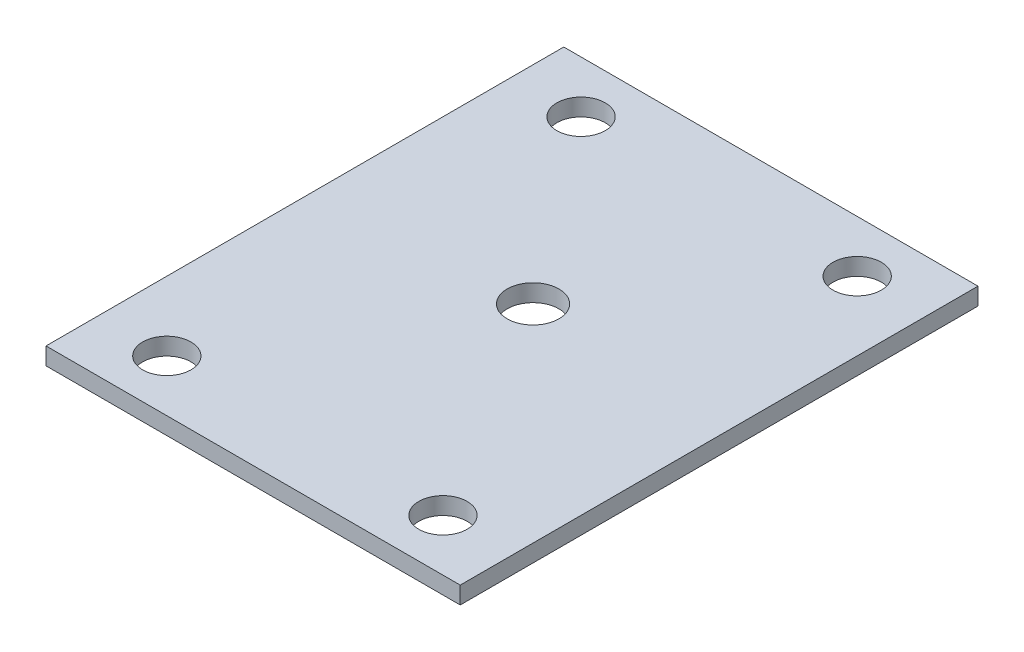
ISO-10303-21;
HEADER;
FILE_DESCRIPTION(('STEP AP214'),'2;1');
FILE_NAME('part.step','',(''),(''),'','','');
FILE_SCHEMA(('AUTOMOTIVE_DESIGN { 1 0 10303 214 1 1 1 1 }'));
ENDSEC;
DATA;
#1=APPLICATION_CONTEXT('core data for automotive mechanical design processes');
#2=APPLICATION_PROTOCOL_DEFINITION('international standard','automotive_design',2000,#1);
#3=PRODUCT_CONTEXT('',#1,'mechanical');
#4=PRODUCT('Part','Part','',(#3));
#5=PRODUCT_RELATED_PRODUCT_CATEGORY('part','',(#4));
#6=PRODUCT_DEFINITION_FORMATION('','',#4);
#7=PRODUCT_DEFINITION_CONTEXT('part definition',#1,'design');
#8=PRODUCT_DEFINITION('design','',#6,#7);
#9=PRODUCT_DEFINITION_SHAPE('','',#8);
#10=(LENGTH_UNIT() NAMED_UNIT(*) SI_UNIT(.MILLI.,.METRE.));
#11=(NAMED_UNIT(*) PLANE_ANGLE_UNIT() SI_UNIT($,.RADIAN.));
#12=(NAMED_UNIT(*) SI_UNIT($,.STERADIAN.) SOLID_ANGLE_UNIT());
#13=UNCERTAINTY_MEASURE_WITH_UNIT(LENGTH_MEASURE(1.E-05),#10,'distance_accuracy_value','');
#14=(GEOMETRIC_REPRESENTATION_CONTEXT(3) GLOBAL_UNCERTAINTY_ASSIGNED_CONTEXT((#13)) GLOBAL_UNIT_ASSIGNED_CONTEXT((#10,
#11,#12)) REPRESENTATION_CONTEXT('',''));
#15=CARTESIAN_POINT('',(0.,0.,0.));
#16=DIRECTION('',(0.,0.,1.));
#17=DIRECTION('',(1.,0.,0.));
#18=AXIS2_PLACEMENT_3D('',#15,#16,#17);
#19=CARTESIAN_POINT('',(0.,1.27,0.));
#20=DIRECTION('',(0.,1.,0.));
#21=DIRECTION('',(0.,0.,1.));
#22=AXIS2_PLACEMENT_3D('',#19,#20,#21);
#23=PLANE('',#22);
#24=CARTESIAN_POINT('',(0.,1.27,-1.5494));
#25=DIRECTION('',(0.,-1.,0.));
#26=DIRECTION('',(0.,0.,-1.));
#27=AXIS2_PLACEMENT_3D('',#24,#25,#26);
#28=CIRCLE('',#27,1.905);
#29=CARTESIAN_POINT('',(0.,1.27,-3.4544));
#30=VERTEX_POINT('',#29);
#31=EDGE_CURVE('E166',#30,#30,#28,.T.);
#32=ORIENTED_EDGE('',*,*,#31,.T.);
#33=EDGE_LOOP('',(#32));
#34=FACE_BOUND('',#33,.T.);
#35=CARTESIAN_POINT('',(-10.16,1.27,15.24));
#36=DIRECTION('',(0.,1.,0.));
#37=DIRECTION('',(0.,0.,-1.));
#38=AXIS2_PLACEMENT_3D('',#35,#36,#37);
#39=CIRCLE('',#38,1.778);
#40=CARTESIAN_POINT('',(-10.16,1.27,13.462));
#41=VERTEX_POINT('',#40);
#42=EDGE_CURVE('E149',#41,#41,#39,.T.);
#43=ORIENTED_EDGE('',*,*,#42,.F.);
#44=EDGE_LOOP('',(#43));
#45=FACE_BOUND('',#44,.T.);
#46=CARTESIAN_POINT('',(-10.16,1.27,-15.24));
#47=DIRECTION('',(0.,1.,0.));
#48=DIRECTION('',(0.,0.,1.));
#49=AXIS2_PLACEMENT_3D('',#46,#47,#48);
#50=CIRCLE('',#49,1.778);
#51=CARTESIAN_POINT('',(-10.16,1.27,-13.462));
#52=VERTEX_POINT('',#51);
#53=EDGE_CURVE('E117',#52,#52,#50,.T.);
#54=ORIENTED_EDGE('',*,*,#53,.F.);
#55=EDGE_LOOP('',(#54));
#56=FACE_BOUND('',#55,.T.);
#57=DIRECTION('',(0.,0.,1.));
#58=VECTOR('',#57,1.);
#59=CARTESIAN_POINT('',(-15.24,1.27,19.05));
#60=LINE('',#59,#58);
#61=CARTESIAN_POINT('',(-15.24,1.27,-19.05));
#62=VERTEX_POINT('',#61);
#63=CARTESIAN_POINT('',(-15.24,1.27,19.05));
#64=VERTEX_POINT('',#63);
#65=EDGE_CURVE('E96',#62,#64,#60,.T.);
#66=ORIENTED_EDGE('',*,*,#65,.T.);
#67=DIRECTION('',(1.,0.,0.));
#68=VECTOR('',#67,1.);
#69=CARTESIAN_POINT('',(15.24,1.27,19.05));
#70=LINE('',#69,#68);
#71=CARTESIAN_POINT('',(15.24,1.27,19.05));
#72=VERTEX_POINT('',#71);
#73=EDGE_CURVE('E92',#64,#72,#70,.T.);
#74=ORIENTED_EDGE('',*,*,#73,.T.);
#75=DIRECTION('',(0.,0.,-1.));
#76=VECTOR('',#75,1.);
#77=CARTESIAN_POINT('',(15.24,1.27,19.05));
#78=LINE('',#77,#76);
#79=CARTESIAN_POINT('',(15.24,1.27,-19.05));
#80=VERTEX_POINT('',#79);
#81=EDGE_CURVE('E98',#72,#80,#78,.T.);
#82=ORIENTED_EDGE('',*,*,#81,.T.);
#83=DIRECTION('',(-1.,0.,0.));
#84=VECTOR('',#83,1.);
#85=CARTESIAN_POINT('',(15.24,1.27,-19.05));
#86=LINE('',#85,#84);
#87=EDGE_CURVE('E64',#80,#62,#86,.T.);
#88=ORIENTED_EDGE('',*,*,#87,.T.);
#89=EDGE_LOOP('',(#66,#74,#82,#88));
#90=FACE_BOUND('',#89,.T.);
#91=CARTESIAN_POINT('',(10.16,1.27,-15.24));
#92=DIRECTION('',(0.,1.,0.));
#93=DIRECTION('',(0.,0.,-1.));
#94=AXIS2_PLACEMENT_3D('',#91,#92,#93);
#95=CIRCLE('',#94,1.778);
#96=CARTESIAN_POINT('',(10.16,1.27,-17.018));
#97=VERTEX_POINT('',#96);
#98=EDGE_CURVE('E139',#97,#97,#95,.T.);
#99=ORIENTED_EDGE('',*,*,#98,.F.);
#100=EDGE_LOOP('',(#99));
#101=FACE_BOUND('',#100,.T.);
#102=CARTESIAN_POINT('',(10.16,1.27,15.24));
#103=DIRECTION('',(0.,1.,0.));
#104=DIRECTION('',(0.,0.,1.));
#105=AXIS2_PLACEMENT_3D('',#102,#103,#104);
#106=CIRCLE('',#105,1.778);
#107=CARTESIAN_POINT('',(10.16,1.27,17.018));
#108=VERTEX_POINT('',#107);
#109=EDGE_CURVE('E156',#108,#108,#106,.T.);
#110=ORIENTED_EDGE('',*,*,#109,.F.);
#111=EDGE_LOOP('',(#110));
#112=FACE_BOUND('',#111,.T.);
#113=ADVANCED_FACE('F44',(#34,#45,#56,#90,#101,#112),#23,.T.);
#114=CARTESIAN_POINT('',(0.,0.,0.));
#115=DIRECTION('',(0.,1.,0.));
#116=DIRECTION('',(0.,0.,1.));
#117=AXIS2_PLACEMENT_3D('',#114,#115,#116);
#118=PLANE('',#117);
#119=CARTESIAN_POINT('',(0.,0.,-1.5494));
#120=DIRECTION('',(0.,-1.,0.));
#121=DIRECTION('',(0.,0.,-1.));
#122=AXIS2_PLACEMENT_3D('',#119,#120,#121);
#123=CIRCLE('',#122,1.905);
#124=CARTESIAN_POINT('',(0.,0.,-3.4544));
#125=VERTEX_POINT('',#124);
#126=EDGE_CURVE('E165',#125,#125,#123,.T.);
#127=ORIENTED_EDGE('',*,*,#126,.F.);
#128=EDGE_LOOP('',(#127));
#129=FACE_BOUND('',#128,.T.);
#130=DIRECTION('',(0.,0.,1.));
#131=VECTOR('',#130,1.);
#132=CARTESIAN_POINT('',(-15.24,0.,19.05));
#133=LINE('',#132,#131);
#134=CARTESIAN_POINT('',(-15.24,0.,-19.05));
#135=VERTEX_POINT('',#134);
#136=CARTESIAN_POINT('',(-15.24,0.,19.05));
#137=VERTEX_POINT('',#136);
#138=EDGE_CURVE('E112',#135,#137,#133,.T.);
#139=ORIENTED_EDGE('',*,*,#138,.F.);
#140=DIRECTION('',(-1.,0.,0.));
#141=VECTOR('',#140,1.);
#142=CARTESIAN_POINT('',(15.24,0.,-19.05));
#143=LINE('',#142,#141);
#144=CARTESIAN_POINT('',(15.24,0.,-19.05));
#145=VERTEX_POINT('',#144);
#146=EDGE_CURVE('E87',#145,#135,#143,.T.);
#147=ORIENTED_EDGE('',*,*,#146,.F.);
#148=DIRECTION('',(0.,0.,-1.));
#149=VECTOR('',#148,1.);
#150=CARTESIAN_POINT('',(15.24,0.,19.05));
#151=LINE('',#150,#149);
#152=CARTESIAN_POINT('',(15.24,0.,19.05));
#153=VERTEX_POINT('',#152);
#154=EDGE_CURVE('E78',#153,#145,#151,.T.);
#155=ORIENTED_EDGE('',*,*,#154,.F.);
#156=DIRECTION('',(1.,0.,0.));
#157=VECTOR('',#156,1.);
#158=CARTESIAN_POINT('',(15.24,0.,19.05));
#159=LINE('',#158,#157);
#160=EDGE_CURVE('E101',#137,#153,#159,.T.);
#161=ORIENTED_EDGE('',*,*,#160,.F.);
#162=EDGE_LOOP('',(#139,#147,#155,#161));
#163=FACE_BOUND('',#162,.T.);
#164=CARTESIAN_POINT('',(-10.16,0.,-15.24));
#165=DIRECTION('',(0.,1.,0.));
#166=DIRECTION('',(0.,0.,1.));
#167=AXIS2_PLACEMENT_3D('',#164,#165,#166);
#168=CIRCLE('',#167,1.778);
#169=CARTESIAN_POINT('',(-10.16,0.,-13.462));
#170=VERTEX_POINT('',#169);
#171=EDGE_CURVE('E136',#170,#170,#168,.T.);
#172=ORIENTED_EDGE('',*,*,#171,.T.);
#173=EDGE_LOOP('',(#172));
#174=FACE_BOUND('',#173,.T.);
#175=CARTESIAN_POINT('',(10.16,0.,-15.24));
#176=DIRECTION('',(0.,1.,0.));
#177=DIRECTION('',(0.,0.,-1.));
#178=AXIS2_PLACEMENT_3D('',#175,#176,#177);
#179=CIRCLE('',#178,1.778);
#180=CARTESIAN_POINT('',(10.16,0.,-17.018));
#181=VERTEX_POINT('',#180);
#182=EDGE_CURVE('E144',#181,#181,#179,.T.);
#183=ORIENTED_EDGE('',*,*,#182,.T.);
#184=EDGE_LOOP('',(#183));
#185=FACE_BOUND('',#184,.T.);
#186=CARTESIAN_POINT('',(-10.16,0.,15.24));
#187=DIRECTION('',(0.,1.,0.));
#188=DIRECTION('',(0.,0.,-1.));
#189=AXIS2_PLACEMENT_3D('',#186,#187,#188);
#190=CIRCLE('',#189,1.778);
#191=CARTESIAN_POINT('',(-10.16,0.,13.462));
#192=VERTEX_POINT('',#191);
#193=EDGE_CURVE('E155',#192,#192,#190,.T.);
#194=ORIENTED_EDGE('',*,*,#193,.T.);
#195=EDGE_LOOP('',(#194));
#196=FACE_BOUND('',#195,.T.);
#197=CARTESIAN_POINT('',(10.16,0.,15.24));
#198=DIRECTION('',(0.,1.,0.));
#199=DIRECTION('',(0.,0.,1.));
#200=AXIS2_PLACEMENT_3D('',#197,#198,#199);
#201=CIRCLE('',#200,1.778);
#202=CARTESIAN_POINT('',(10.16,0.,17.018));
#203=VERTEX_POINT('',#202);
#204=EDGE_CURVE('E159',#203,#203,#201,.T.);
#205=ORIENTED_EDGE('',*,*,#204,.T.);
#206=EDGE_LOOP('',(#205));
#207=FACE_BOUND('',#206,.T.);
#208=ADVANCED_FACE('F132',(#129,#163,#174,#185,#196,#207),#118,.F.);
#209=CARTESIAN_POINT('',(-15.24,1.27,19.05));
#210=DIRECTION('',(1.,0.,0.));
#211=DIRECTION('',(0.,0.,-1.));
#212=AXIS2_PLACEMENT_3D('',#209,#210,#211);
#213=PLANE('',#212);
#214=ORIENTED_EDGE('',*,*,#138,.T.);
#215=DIRECTION('',(0.,-1.,0.));
#216=VECTOR('',#215,1.);
#217=CARTESIAN_POINT('',(-15.24,1.27,19.05));
#218=LINE('',#217,#216);
#219=EDGE_CURVE('E11',#64,#137,#218,.T.);
#220=ORIENTED_EDGE('',*,*,#219,.F.);
#221=ORIENTED_EDGE('',*,*,#65,.F.);
#222=DIRECTION('',(0.,-1.,0.));
#223=VECTOR('',#222,1.);
#224=CARTESIAN_POINT('',(-15.24,1.27,-19.05));
#225=LINE('',#224,#223);
#226=EDGE_CURVE('E109',#62,#135,#225,.T.);
#227=ORIENTED_EDGE('',*,*,#226,.T.);
#228=EDGE_LOOP('',(#214,#220,#221,#227));
#229=FACE_BOUND('',#228,.T.);
#230=ADVANCED_FACE('F50',(#229),#213,.F.);
#231=CARTESIAN_POINT('',(15.24,1.27,19.05));
#232=DIRECTION('',(0.,0.,-1.));
#233=DIRECTION('',(-1.,0.,0.));
#234=AXIS2_PLACEMENT_3D('',#231,#232,#233);
#235=PLANE('',#234);
#236=ORIENTED_EDGE('',*,*,#160,.T.);
#237=DIRECTION('',(0.,-1.,0.));
#238=VECTOR('',#237,1.);
#239=CARTESIAN_POINT('',(15.24,1.27,19.05));
#240=LINE('',#239,#238);
#241=EDGE_CURVE('E54',#72,#153,#240,.T.);
#242=ORIENTED_EDGE('',*,*,#241,.F.);
#243=ORIENTED_EDGE('',*,*,#73,.F.);
#244=ORIENTED_EDGE('',*,*,#219,.T.);
#245=EDGE_LOOP('',(#236,#242,#243,#244));
#246=FACE_BOUND('',#245,.T.);
#247=ADVANCED_FACE('F105',(#246),#235,.F.);
#248=CARTESIAN_POINT('',(15.24,1.27,19.05));
#249=DIRECTION('',(-1.,0.,0.));
#250=DIRECTION('',(0.,0.,1.));
#251=AXIS2_PLACEMENT_3D('',#248,#249,#250);
#252=PLANE('',#251);
#253=ORIENTED_EDGE('',*,*,#154,.T.);
#254=DIRECTION('',(0.,-1.,0.));
#255=VECTOR('',#254,1.);
#256=CARTESIAN_POINT('',(15.24,1.27,-19.05));
#257=LINE('',#256,#255);
#258=EDGE_CURVE('E102',#80,#145,#257,.T.);
#259=ORIENTED_EDGE('',*,*,#258,.F.);
#260=ORIENTED_EDGE('',*,*,#81,.F.);
#261=ORIENTED_EDGE('',*,*,#241,.T.);
#262=EDGE_LOOP('',(#253,#259,#260,#261));
#263=FACE_BOUND('',#262,.T.);
#264=ADVANCED_FACE('F106',(#263),#252,.F.);
#265=CARTESIAN_POINT('',(15.24,1.27,-19.05));
#266=DIRECTION('',(0.,0.,1.));
#267=DIRECTION('',(1.,0.,0.));
#268=AXIS2_PLACEMENT_3D('',#265,#266,#267);
#269=PLANE('',#268);
#270=ORIENTED_EDGE('',*,*,#146,.T.);
#271=ORIENTED_EDGE('',*,*,#226,.F.);
#272=ORIENTED_EDGE('',*,*,#87,.F.);
#273=ORIENTED_EDGE('',*,*,#258,.T.);
#274=EDGE_LOOP('',(#270,#271,#272,#273));
#275=FACE_BOUND('',#274,.T.);
#276=ADVANCED_FACE('F129',(#275),#269,.F.);
#277=CARTESIAN_POINT('',(-10.16,1.27,-15.24));
#278=DIRECTION('',(0.,-1.,0.));
#279=DIRECTION('',(0.,0.,-1.));
#280=AXIS2_PLACEMENT_3D('',#277,#278,#279);
#281=CYLINDRICAL_SURFACE('',#280,1.778);
#282=ORIENTED_EDGE('',*,*,#53,.T.);
#283=EDGE_LOOP('',(#282));
#284=FACE_BOUND('',#283,.T.);
#285=ORIENTED_EDGE('',*,*,#171,.F.);
#286=EDGE_LOOP('',(#285));
#287=FACE_BOUND('',#286,.T.);
#288=ADVANCED_FACE('F192',(#284,#287),#281,.F.);
#289=CARTESIAN_POINT('',(10.16,1.27,-15.24));
#290=DIRECTION('',(0.,-1.,0.));
#291=DIRECTION('',(0.,0.,-1.));
#292=AXIS2_PLACEMENT_3D('',#289,#290,#291);
#293=CYLINDRICAL_SURFACE('',#292,1.778);
#294=ORIENTED_EDGE('',*,*,#98,.T.);
#295=EDGE_LOOP('',(#294));
#296=FACE_BOUND('',#295,.T.);
#297=ORIENTED_EDGE('',*,*,#182,.F.);
#298=EDGE_LOOP('',(#297));
#299=FACE_BOUND('',#298,.T.);
#300=ADVANCED_FACE('F213',(#296,#299),#293,.F.);
#301=CARTESIAN_POINT('',(-10.16,1.27,15.24));
#302=DIRECTION('',(0.,-1.,0.));
#303=DIRECTION('',(0.,0.,-1.));
#304=AXIS2_PLACEMENT_3D('',#301,#302,#303);
#305=CYLINDRICAL_SURFACE('',#304,1.778);
#306=ORIENTED_EDGE('',*,*,#42,.T.);
#307=EDGE_LOOP('',(#306));
#308=FACE_BOUND('',#307,.T.);
#309=ORIENTED_EDGE('',*,*,#193,.F.);
#310=EDGE_LOOP('',(#309));
#311=FACE_BOUND('',#310,.T.);
#312=ADVANCED_FACE('F222',(#308,#311),#305,.F.);
#313=CARTESIAN_POINT('',(10.16,1.27,15.24));
#314=DIRECTION('',(0.,-1.,0.));
#315=DIRECTION('',(0.,0.,-1.));
#316=AXIS2_PLACEMENT_3D('',#313,#314,#315);
#317=CYLINDRICAL_SURFACE('',#316,1.778);
#318=ORIENTED_EDGE('',*,*,#109,.T.);
#319=EDGE_LOOP('',(#318));
#320=FACE_BOUND('',#319,.T.);
#321=ORIENTED_EDGE('',*,*,#204,.F.);
#322=EDGE_LOOP('',(#321));
#323=FACE_BOUND('',#322,.T.);
#324=ADVANCED_FACE('F235',(#320,#323),#317,.F.);
#325=CARTESIAN_POINT('',(0.,1.27,-1.5494));
#326=DIRECTION('',(0.,-1.,0.));
#327=DIRECTION('',(0.,0.,-1.));
#328=AXIS2_PLACEMENT_3D('',#325,#326,#327);
#329=CYLINDRICAL_SURFACE('',#328,1.905);
#330=ORIENTED_EDGE('',*,*,#31,.F.);
#331=EDGE_LOOP('',(#330));
#332=FACE_BOUND('',#331,.T.);
#333=ORIENTED_EDGE('',*,*,#126,.T.);
#334=EDGE_LOOP('',(#333));
#335=FACE_BOUND('',#334,.T.);
#336=ADVANCED_FACE('F176',(#332,#335),#329,.F.);
#337=CLOSED_SHELL('',(#113,#208,#230,#247,#264,#276,#288,#300,#312,#324,#336));
#338=MANIFOLD_SOLID_BREP('B2',#337);
#339=ADVANCED_BREP_SHAPE_REPRESENTATION('',(#18,#338),#14);
#340=SHAPE_DEFINITION_REPRESENTATION(#9,#339);
ENDSEC;
END-ISO-10303-21;
